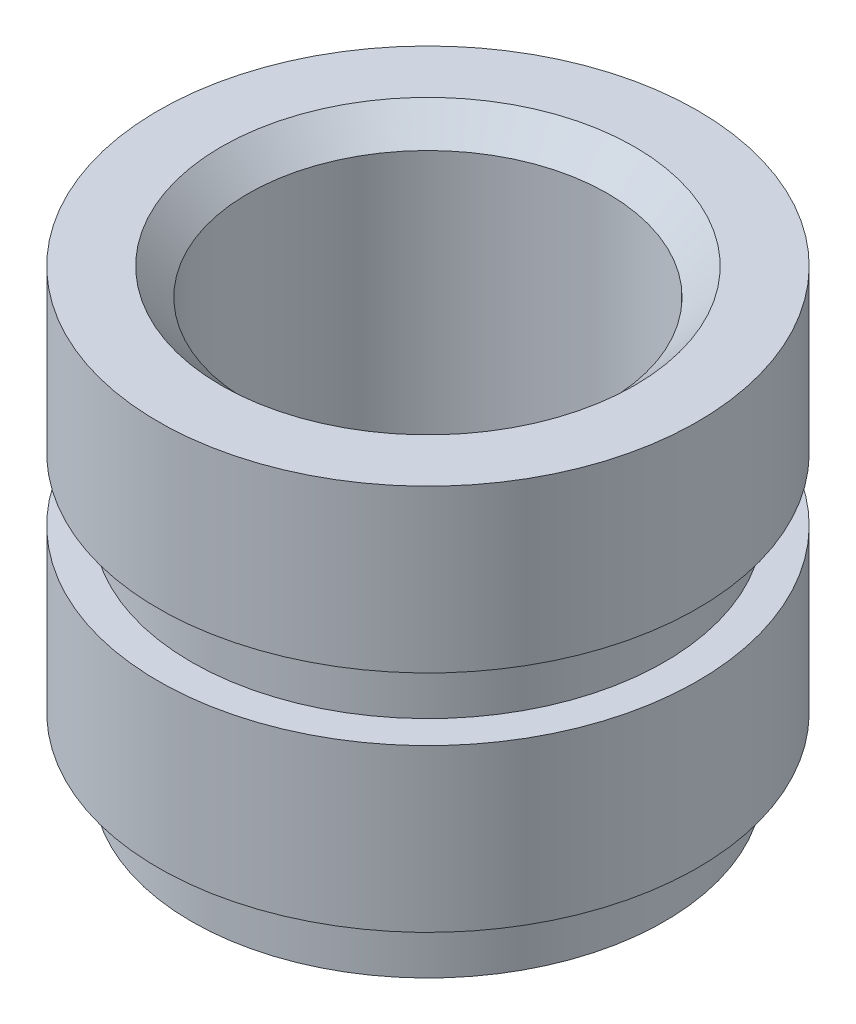
ISO-10303-21;
HEADER;
FILE_DESCRIPTION(('STEP AP214'),'2;1');
FILE_NAME('part.step','',(''),(''),'','','');
FILE_SCHEMA(('AUTOMOTIVE_DESIGN { 1 0 10303 214 1 1 1 1 }'));
ENDSEC;
DATA;
#1=APPLICATION_CONTEXT('core data for automotive mechanical design processes');
#2=APPLICATION_PROTOCOL_DEFINITION('international standard','automotive_design',2000,#1);
#3=PRODUCT_CONTEXT('',#1,'mechanical');
#4=PRODUCT('Part','Part','',(#3));
#5=PRODUCT_RELATED_PRODUCT_CATEGORY('part','',(#4));
#6=PRODUCT_DEFINITION_FORMATION('','',#4);
#7=PRODUCT_DEFINITION_CONTEXT('part definition',#1,'design');
#8=PRODUCT_DEFINITION('design','',#6,#7);
#9=PRODUCT_DEFINITION_SHAPE('','',#8);
#10=(LENGTH_UNIT() NAMED_UNIT(*) SI_UNIT(.MILLI.,.METRE.));
#11=(NAMED_UNIT(*) PLANE_ANGLE_UNIT() SI_UNIT($,.RADIAN.));
#12=(NAMED_UNIT(*) SI_UNIT($,.STERADIAN.) SOLID_ANGLE_UNIT());
#13=UNCERTAINTY_MEASURE_WITH_UNIT(LENGTH_MEASURE(1.E-05),#10,'distance_accuracy_value','');
#14=(GEOMETRIC_REPRESENTATION_CONTEXT(3) GLOBAL_UNCERTAINTY_ASSIGNED_CONTEXT((#13)) GLOBAL_UNIT_ASSIGNED_CONTEXT((#10,
#11,#12)) REPRESENTATION_CONTEXT('',''));
#15=CARTESIAN_POINT('',(0.,0.,0.));
#16=DIRECTION('',(0.,0.,1.));
#17=DIRECTION('',(1.,0.,0.));
#18=AXIS2_PLACEMENT_3D('',#15,#16,#17);
#19=CARTESIAN_POINT('',(-1.3158844765343,0.183754512635382,0.));
#20=DIRECTION('',(0.,-1.,0.));
#21=DIRECTION('',(0.,0.,-1.));
#22=AXIS2_PLACEMENT_3D('',#19,#20,#21);
#23=PLANE('',#22);
#24=CARTESIAN_POINT('',(0.,0.183754512635382,0.));
#25=DIRECTION('',(0.,-1.,0.));
#26=DIRECTION('',(0.,0.,-1.));
#27=AXIS2_PLACEMENT_3D('',#24,#25,#26);
#28=CIRCLE('',#27,1.5);
#29=CARTESIAN_POINT('',(0.,0.183754512635382,-1.5));
#30=VERTEX_POINT('',#29);
#31=EDGE_CURVE('E55',#30,#30,#28,.T.);
#32=ORIENTED_EDGE('',*,*,#31,.F.);
#33=EDGE_LOOP('',(#32));
#34=FACE_BOUND('',#33,.T.);
#35=CARTESIAN_POINT('',(0.,0.183754512635382,0.));
#36=DIRECTION('',(0.,-1.,0.));
#37=DIRECTION('',(0.,0.,-1.));
#38=AXIS2_PLACEMENT_3D('',#35,#36,#37);
#39=CIRCLE('',#38,1.3158844765343);
#40=CARTESIAN_POINT('',(0.,0.183754512635382,-1.3158844765343));
#41=VERTEX_POINT('',#40);
#42=EDGE_CURVE('E76',#41,#41,#39,.T.);
#43=ORIENTED_EDGE('',*,*,#42,.T.);
#44=EDGE_LOOP('',(#43));
#45=FACE_BOUND('',#44,.T.);
#46=ADVANCED_FACE('F35',(#34,#45),#23,.F.);
#47=CARTESIAN_POINT('',(0.,-2.60469314079422,0.));
#48=DIRECTION('',(0.,-1.,0.));
#49=DIRECTION('',(0.,0.,-1.));
#50=AXIS2_PLACEMENT_3D('',#47,#48,#49);
#51=CYLINDRICAL_SURFACE('',#50,1.5);
#52=CARTESIAN_POINT('',(0.,-0.716245487364618,0.));
#53=DIRECTION('',(0.,-1.,0.));
#54=DIRECTION('',(0.,0.,-1.));
#55=AXIS2_PLACEMENT_3D('',#52,#53,#54);
#56=CIRCLE('',#55,1.5);
#57=CARTESIAN_POINT('',(0.,-0.716245487364618,-1.5));
#58=VERTEX_POINT('',#57);
#59=EDGE_CURVE('E58',#58,#58,#56,.T.);
#60=ORIENTED_EDGE('',*,*,#59,.F.);
#61=EDGE_LOOP('',(#60));
#62=FACE_BOUND('',#61,.T.);
#63=ORIENTED_EDGE('',*,*,#31,.T.);
#64=EDGE_LOOP('',(#63));
#65=FACE_BOUND('',#64,.T.);
#66=ADVANCED_FACE('F111',(#62,#65),#51,.T.);
#67=CARTESIAN_POINT('',(-1.5,-0.716245487364618,0.));
#68=DIRECTION('',(0.,1.,0.));
#69=DIRECTION('',(0.,0.,1.));
#70=AXIS2_PLACEMENT_3D('',#67,#68,#69);
#71=PLANE('',#70);
#72=CARTESIAN_POINT('',(0.,-0.716245487364618,0.));
#73=DIRECTION('',(0.,-1.,0.));
#74=DIRECTION('',(0.,0.,-1.));
#75=AXIS2_PLACEMENT_3D('',#72,#73,#74);
#76=CIRCLE('',#75,1.3158844765343);
#77=CARTESIAN_POINT('',(0.,-0.716245487364618,-1.3158844765343));
#78=VERTEX_POINT('',#77);
#79=EDGE_CURVE('E61',#78,#78,#76,.T.);
#80=ORIENTED_EDGE('',*,*,#79,.F.);
#81=EDGE_LOOP('',(#80));
#82=FACE_BOUND('',#81,.T.);
#83=ORIENTED_EDGE('',*,*,#59,.T.);
#84=EDGE_LOOP('',(#83));
#85=FACE_BOUND('',#84,.T.);
#86=ADVANCED_FACE('F117',(#82,#85),#71,.F.);
#87=CARTESIAN_POINT('',(0.,-2.60469314079422,0.));
#88=DIRECTION('',(0.,-1.,0.));
#89=DIRECTION('',(0.,0.,-1.));
#90=AXIS2_PLACEMENT_3D('',#87,#88,#89);
#91=CYLINDRICAL_SURFACE('',#90,1.3158844765343);
#92=CARTESIAN_POINT('',(0.,-1.06624548736462,0.));
#93=DIRECTION('',(0.,-1.,0.));
#94=DIRECTION('',(0.,0.,-1.));
#95=AXIS2_PLACEMENT_3D('',#92,#93,#94);
#96=CIRCLE('',#95,1.3158844765343);
#97=CARTESIAN_POINT('',(0.,-1.06624548736462,-1.3158844765343));
#98=VERTEX_POINT('',#97);
#99=EDGE_CURVE('E64',#98,#98,#96,.T.);
#100=ORIENTED_EDGE('',*,*,#99,.F.);
#101=EDGE_LOOP('',(#100));
#102=FACE_BOUND('',#101,.T.);
#103=ORIENTED_EDGE('',*,*,#79,.T.);
#104=EDGE_LOOP('',(#103));
#105=FACE_BOUND('',#104,.T.);
#106=ADVANCED_FACE('F160',(#102,#105),#91,.T.);
#107=CARTESIAN_POINT('',(-1.,-1.06624548736462,0.));
#108=DIRECTION('',(0.,1.,0.));
#109=DIRECTION('',(0.,0.,1.));
#110=AXIS2_PLACEMENT_3D('',#107,#108,#109);
#111=PLANE('',#110);
#112=CARTESIAN_POINT('',(0.,-1.06624548736462,0.));
#113=DIRECTION('',(0.,1.,0.));
#114=DIRECTION('',(0.,0.,1.));
#115=AXIS2_PLACEMENT_3D('',#112,#113,#114);
#116=CIRCLE('',#115,1.15);
#117=CARTESIAN_POINT('',(0.,-1.06624548736462,-1.15));
#118=VERTEX_POINT('',#117);
#119=EDGE_CURVE('E42',#118,#118,#116,.T.);
#120=ORIENTED_EDGE('',*,*,#119,.T.);
#121=EDGE_LOOP('',(#120));
#122=FACE_BOUND('',#121,.T.);
#123=ORIENTED_EDGE('',*,*,#99,.T.);
#124=EDGE_LOOP('',(#123));
#125=FACE_BOUND('',#124,.T.);
#126=ADVANCED_FACE('F107',(#122,#125),#111,.F.);
#127=CARTESIAN_POINT('',(0.,-2.60469314079422,0.));
#128=DIRECTION('',(0.,-1.,0.));
#129=DIRECTION('',(0.,0.,-1.));
#130=AXIS2_PLACEMENT_3D('',#127,#128,#129);
#131=CYLINDRICAL_SURFACE('',#130,1.);
#132=CARTESIAN_POINT('',(0.,-0.916245487364617,0.));
#133=DIRECTION('',(0.,1.,0.));
#134=DIRECTION('',(0.,0.,1.));
#135=AXIS2_PLACEMENT_3D('',#132,#133,#134);
#136=CIRCLE('',#135,1.);
#137=CARTESIAN_POINT('',(0.,-0.916245487364617,-1.));
#138=VERTEX_POINT('',#137);
#139=EDGE_CURVE('E46',#138,#138,#136,.F.);
#140=ORIENTED_EDGE('',*,*,#139,.T.);
#141=EDGE_LOOP('',(#140));
#142=FACE_BOUND('',#141,.T.);
#143=CARTESIAN_POINT('',(0.,1.28375451263538,0.));
#144=DIRECTION('',(0.,-1.,0.));
#145=DIRECTION('',(0.,0.,-1.));
#146=AXIS2_PLACEMENT_3D('',#143,#144,#145);
#147=CIRCLE('',#146,1.);
#148=CARTESIAN_POINT('',(0.,1.28375451263538,-1.));
#149=VERTEX_POINT('',#148);
#150=EDGE_CURVE('E50',#149,#149,#147,.F.);
#151=ORIENTED_EDGE('',*,*,#150,.T.);
#152=EDGE_LOOP('',(#151));
#153=FACE_BOUND('',#152,.T.);
#154=ADVANCED_FACE('F102',(#142,#153),#131,.F.);
#155=CARTESIAN_POINT('',(-1.,1.43375451263538,0.));
#156=DIRECTION('',(0.,-1.,0.));
#157=DIRECTION('',(0.,0.,-1.));
#158=AXIS2_PLACEMENT_3D('',#155,#156,#157);
#159=PLANE('',#158);
#160=CARTESIAN_POINT('',(0.,1.43375451263538,0.));
#161=DIRECTION('',(0.,-1.,0.));
#162=DIRECTION('',(0.,0.,-1.));
#163=AXIS2_PLACEMENT_3D('',#160,#161,#162);
#164=CIRCLE('',#163,1.15);
#165=CARTESIAN_POINT('',(0.,1.43375451263538,-1.15));
#166=VERTEX_POINT('',#165);
#167=EDGE_CURVE('E10',#166,#166,#164,.T.);
#168=ORIENTED_EDGE('',*,*,#167,.T.);
#169=EDGE_LOOP('',(#168));
#170=FACE_BOUND('',#169,.T.);
#171=CARTESIAN_POINT('',(0.,1.43375451263538,0.));
#172=DIRECTION('',(0.,-1.,0.));
#173=DIRECTION('',(0.,0.,-1.));
#174=AXIS2_PLACEMENT_3D('',#171,#172,#173);
#175=CIRCLE('',#174,1.5);
#176=CARTESIAN_POINT('',(0.,1.43375451263538,-1.5));
#177=VERTEX_POINT('',#176);
#178=EDGE_CURVE('E67',#177,#177,#175,.T.);
#179=ORIENTED_EDGE('',*,*,#178,.F.);
#180=EDGE_LOOP('',(#179));
#181=FACE_BOUND('',#180,.T.);
#182=ADVANCED_FACE('F97',(#170,#181),#159,.F.);
#183=CARTESIAN_POINT('',(0.,-2.60469314079422,0.));
#184=DIRECTION('',(0.,-1.,0.));
#185=DIRECTION('',(0.,0.,-1.));
#186=AXIS2_PLACEMENT_3D('',#183,#184,#185);
#187=CYLINDRICAL_SURFACE('',#186,1.5);
#188=CARTESIAN_POINT('',(0.,0.533754512635382,0.));
#189=DIRECTION('',(0.,-1.,0.));
#190=DIRECTION('',(0.,0.,-1.));
#191=AXIS2_PLACEMENT_3D('',#188,#189,#190);
#192=CIRCLE('',#191,1.5);
#193=CARTESIAN_POINT('',(0.,0.533754512635382,-1.5));
#194=VERTEX_POINT('',#193);
#195=EDGE_CURVE('E70',#194,#194,#192,.T.);
#196=ORIENTED_EDGE('',*,*,#195,.F.);
#197=EDGE_LOOP('',(#196));
#198=FACE_BOUND('',#197,.T.);
#199=ORIENTED_EDGE('',*,*,#178,.T.);
#200=EDGE_LOOP('',(#199));
#201=FACE_BOUND('',#200,.T.);
#202=ADVANCED_FACE('F91',(#198,#201),#187,.T.);
#203=CARTESIAN_POINT('',(-1.5,0.533754512635382,0.));
#204=DIRECTION('',(0.,1.,0.));
#205=DIRECTION('',(0.,0.,1.));
#206=AXIS2_PLACEMENT_3D('',#203,#204,#205);
#207=PLANE('',#206);
#208=CARTESIAN_POINT('',(0.,0.533754512635382,0.));
#209=DIRECTION('',(0.,-1.,0.));
#210=DIRECTION('',(0.,0.,-1.));
#211=AXIS2_PLACEMENT_3D('',#208,#209,#210);
#212=CIRCLE('',#211,1.3158844765343);
#213=CARTESIAN_POINT('',(0.,0.533754512635382,-1.3158844765343));
#214=VERTEX_POINT('',#213);
#215=EDGE_CURVE('E73',#214,#214,#212,.T.);
#216=ORIENTED_EDGE('',*,*,#215,.F.);
#217=EDGE_LOOP('',(#216));
#218=FACE_BOUND('',#217,.T.);
#219=ORIENTED_EDGE('',*,*,#195,.T.);
#220=EDGE_LOOP('',(#219));
#221=FACE_BOUND('',#220,.T.);
#222=ADVANCED_FACE('F85',(#218,#221),#207,.F.);
#223=CARTESIAN_POINT('',(0.,-2.60469314079422,0.));
#224=DIRECTION('',(0.,-1.,0.));
#225=DIRECTION('',(0.,0.,-1.));
#226=AXIS2_PLACEMENT_3D('',#223,#224,#225);
#227=CYLINDRICAL_SURFACE('',#226,1.3158844765343);
#228=ORIENTED_EDGE('',*,*,#42,.F.);
#229=EDGE_LOOP('',(#228));
#230=FACE_BOUND('',#229,.T.);
#231=ORIENTED_EDGE('',*,*,#215,.T.);
#232=EDGE_LOOP('',(#231));
#233=FACE_BOUND('',#232,.T.);
#234=ADVANCED_FACE('F81',(#230,#233),#227,.T.);
#235=CARTESIAN_POINT('',(0.,-0.916245487364617,0.));
#236=DIRECTION('',(0.,-1.,0.));
#237=DIRECTION('',(0.,0.,-1.));
#238=AXIS2_PLACEMENT_3D('',#235,#236,#237);
#239=CONICAL_SURFACE('',#238,1.,0.78539816339745);
#240=CARTESIAN_POINT('',(0.,-1.06624548736462,-1.15));
#241=CARTESIAN_POINT('',(0.,-1.06468298736462,-1.1484375));
#242=CARTESIAN_POINT('',(0.,-1.06312048736462,-1.146875));
#243=CARTESIAN_POINT('',(0.,-1.05999548736462,-1.14375));
#244=CARTESIAN_POINT('',(0.,-1.05843298736462,-1.1421875));
#245=CARTESIAN_POINT('',(0.,-1.05530798736462,-1.1390625));
#246=CARTESIAN_POINT('',(0.,-1.05374548736462,-1.1375));
#247=CARTESIAN_POINT('',(0.,-1.05062048736462,-1.134375));
#248=CARTESIAN_POINT('',(0.,-1.04905798736462,-1.1328125));
#249=CARTESIAN_POINT('',(0.,-1.04593298736462,-1.1296875));
#250=CARTESIAN_POINT('',(0.,-1.04437048736462,-1.128125));
#251=CARTESIAN_POINT('',(0.,-1.04124548736462,-1.125));
#252=CARTESIAN_POINT('',(0.,-1.03968298736462,-1.1234375));
#253=CARTESIAN_POINT('',(0.,-1.03655798736462,-1.1203125));
#254=CARTESIAN_POINT('',(0.,-1.03499548736462,-1.11875));
#255=CARTESIAN_POINT('',(0.,-1.03187048736462,-1.115625));
#256=CARTESIAN_POINT('',(0.,-1.03030798736462,-1.1140625));
#257=CARTESIAN_POINT('',(0.,-1.02718298736462,-1.1109375));
#258=CARTESIAN_POINT('',(0.,-1.02562048736462,-1.109375));
#259=CARTESIAN_POINT('',(0.,-1.02249548736462,-1.10625));
#260=CARTESIAN_POINT('',(0.,-1.02093298736462,-1.1046875));
#261=CARTESIAN_POINT('',(0.,-1.01780798736462,-1.1015625));
#262=CARTESIAN_POINT('',(0.,-1.01624548736462,-1.1));
#263=CARTESIAN_POINT('',(0.,-1.01312048736462,-1.096875));
#264=CARTESIAN_POINT('',(0.,-1.01155798736462,-1.0953125));
#265=CARTESIAN_POINT('',(0.,-1.00843298736462,-1.0921875));
#266=CARTESIAN_POINT('',(0.,-1.00687048736462,-1.090625));
#267=CARTESIAN_POINT('',(0.,-1.00374548736462,-1.0875));
#268=CARTESIAN_POINT('',(0.,-1.00218298736462,-1.0859375));
#269=CARTESIAN_POINT('',(0.,-0.999057987364618,-1.0828125));
#270=CARTESIAN_POINT('',(0.,-0.997495487364618,-1.08125));
#271=CARTESIAN_POINT('',(0.,-0.994370487364618,-1.078125));
#272=CARTESIAN_POINT('',(0.,-0.992807987364618,-1.0765625));
#273=CARTESIAN_POINT('',(0.,-0.989682987364618,-1.0734375));
#274=CARTESIAN_POINT('',(0.,-0.988120487364618,-1.071875));
#275=CARTESIAN_POINT('',(0.,-0.984995487364618,-1.06875));
#276=CARTESIAN_POINT('',(0.,-0.983432987364618,-1.0671875));
#277=CARTESIAN_POINT('',(0.,-0.980307987364618,-1.0640625));
#278=CARTESIAN_POINT('',(0.,-0.978745487364618,-1.0625));
#279=CARTESIAN_POINT('',(0.,-0.975620487364618,-1.059375));
#280=CARTESIAN_POINT('',(0.,-0.974057987364618,-1.0578125));
#281=CARTESIAN_POINT('',(0.,-0.970932987364618,-1.0546875));
#282=CARTESIAN_POINT('',(0.,-0.969370487364618,-1.053125));
#283=CARTESIAN_POINT('',(0.,-0.966245487364618,-1.05));
#284=CARTESIAN_POINT('',(0.,-0.964682987364618,-1.0484375));
#285=CARTESIAN_POINT('',(0.,-0.961557987364618,-1.0453125));
#286=CARTESIAN_POINT('',(0.,-0.959995487364618,-1.04375));
#287=CARTESIAN_POINT('',(0.,-0.956870487364618,-1.040625));
#288=CARTESIAN_POINT('',(0.,-0.955307987364618,-1.0390625));
#289=CARTESIAN_POINT('',(0.,-0.952182987364618,-1.0359375));
#290=CARTESIAN_POINT('',(0.,-0.950620487364618,-1.034375));
#291=CARTESIAN_POINT('',(0.,-0.947495487364618,-1.03125));
#292=CARTESIAN_POINT('',(0.,-0.945932987364618,-1.0296875));
#293=CARTESIAN_POINT('',(0.,-0.942807987364618,-1.0265625));
#294=CARTESIAN_POINT('',(0.,-0.941245487364618,-1.025));
#295=CARTESIAN_POINT('',(0.,-0.938120487364618,-1.021875));
#296=CARTESIAN_POINT('',(0.,-0.936557987364618,-1.0203125));
#297=CARTESIAN_POINT('',(0.,-0.933432987364618,-1.0171875));
#298=CARTESIAN_POINT('',(0.,-0.931870487364618,-1.015625));
#299=CARTESIAN_POINT('',(0.,-0.928745487364617,-1.0125));
#300=CARTESIAN_POINT('',(0.,-0.927182987364617,-1.0109375));
#301=CARTESIAN_POINT('',(0.,-0.924057987364618,-1.0078125));
#302=CARTESIAN_POINT('',(0.,-0.922495487364618,-1.00625));
#303=CARTESIAN_POINT('',(0.,-0.919370487364617,-1.003125));
#304=CARTESIAN_POINT('',(0.,-0.917807987364617,-1.0015625));
#305=CARTESIAN_POINT('',(0.,-0.916245487364617,-1.));
#306=B_SPLINE_CURVE_WITH_KNOTS('',3,(#240,#241,#242,#243,#244,#245,#246,#247,#248,#249,#250,
#251,#252,#253,#254,#255,#256,#257,#258,#259,#260,#261,#262,#263,#264,#265,#266,#267,#268,#269,
#270,#271,#272,#273,#274,#275,#276,#277,#278,#279,#280,#281,#282,#283,#284,#285,#286,#287,#288,
#289,#290,#291,#292,#293,#294,#295,#296,#297,#298,#299,#300,#301,#302,#303,#304,#305),
.UNSPECIFIED.,.F.,.F.,(4,2,2,2,2,2,2,2,2,2,2,2,2,2,2,2,2,2,2,2,2,2,2,2,2,2,2,2,2,2,2,2,4),(0.,
0.00662912607362407,0.0132582521472478,0.0198873782208719,0.0265165042944957,0.0331456303681198,
0.0397747564417435,0.0464038825153674,0.0530330085889914,0.0596621346626153,0.0662912607362392,
0.0729203868098631,0.079549512883487,0.0861786389571109,0.0928077650307349,0.0994368911043588,
0.106066017177983,0.112695143251607,0.11932426932523,0.125953395398854,0.132582521472478,
0.139211647546102,0.145840773619726,0.15246989969335,0.159099025766974,0.165728151840598,
0.172357277914222,0.178986403987846,0.18561553006147,0.192244656135094,0.198873782208718,
0.205502908282341,0.212132034355965),.UNSPECIFIED.);
#307=EDGE_CURVE('BSEAM84',#118,#138,#306,.T.);
#308=ORIENTED_EDGE('',*,*,#119,.F.);
#309=ORIENTED_EDGE('',*,*,#139,.F.);
#310=ORIENTED_EDGE('',*,*,#307,.T.);
#311=ORIENTED_EDGE('',*,*,#307,.F.);
#312=EDGE_LOOP('',(#308,#310,#309,#311));
#313=FACE_BOUND('',#312,.T.);
#314=ADVANCED_FACE('F84',(#313),#239,.F.);
#315=CARTESIAN_POINT('',(0.,1.43375451263538,0.));
#316=DIRECTION('',(0.,1.,0.));
#317=DIRECTION('',(0.,0.,1.));
#318=AXIS2_PLACEMENT_3D('',#315,#316,#317);
#319=CONICAL_SURFACE('',#318,1.15,0.78539816339745);
#320=ORIENTED_EDGE('',*,*,#150,.F.);
#321=EDGE_LOOP('',(#320));
#322=FACE_BOUND('',#321,.T.);
#323=ORIENTED_EDGE('',*,*,#167,.F.);
#324=EDGE_LOOP('',(#323));
#325=FACE_BOUND('',#324,.T.);
#326=ADVANCED_FACE('F37',(#322,#325),#319,.F.);
#327=CLOSED_SHELL('',(#46,#66,#86,#106,#126,#154,#182,#202,#222,#234,#314,#326));
#328=MANIFOLD_SOLID_BREP('B2',#327);
#329=ADVANCED_BREP_SHAPE_REPRESENTATION('',(#18,#328),#14);
#330=SHAPE_DEFINITION_REPRESENTATION(#9,#329);
ENDSEC;
END-ISO-10303-21;
